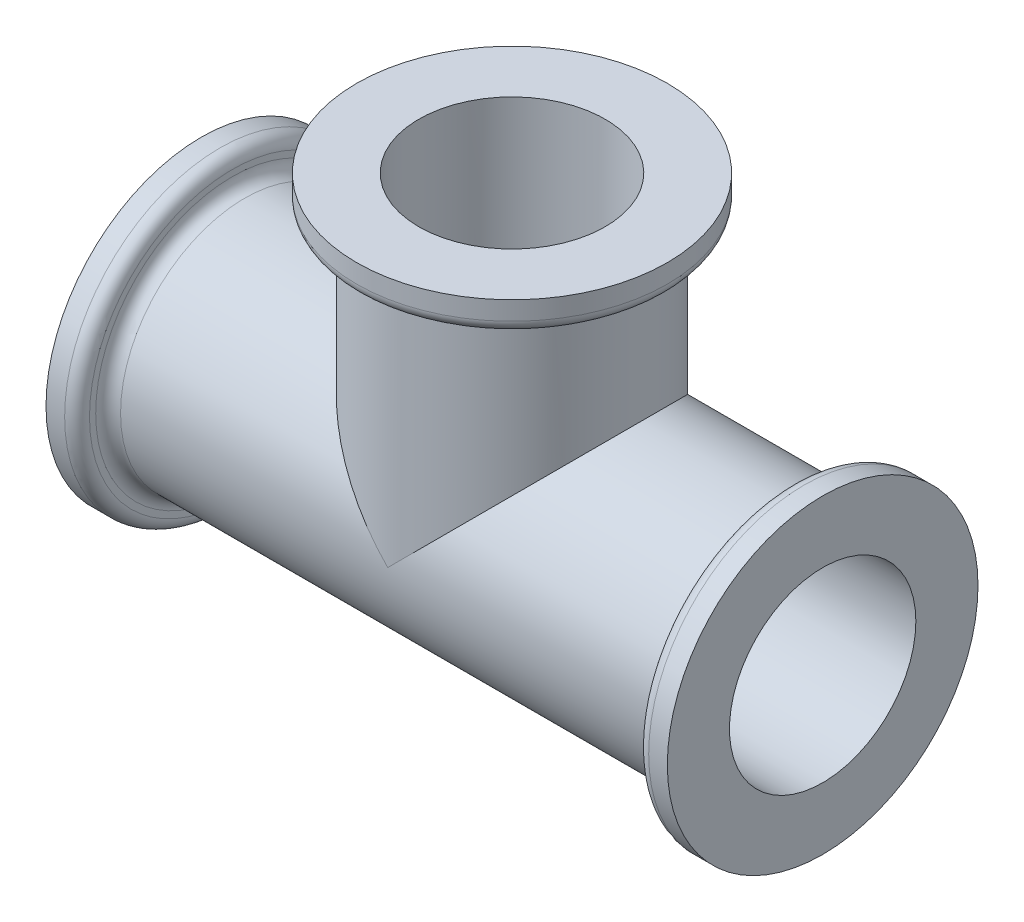
ISO-10303-21;
HEADER;
FILE_DESCRIPTION(('STEP AP214'),'2;1');
FILE_NAME('part.step','',(''),(''),'','','');
FILE_SCHEMA(('AUTOMOTIVE_DESIGN { 1 0 10303 214 1 1 1 1 }'));
ENDSEC;
DATA;
#1=APPLICATION_CONTEXT('core data for automotive mechanical design processes');
#2=APPLICATION_PROTOCOL_DEFINITION('international standard','automotive_design',2000,#1);
#3=PRODUCT_CONTEXT('',#1,'mechanical');
#4=PRODUCT('Part','Part','',(#3));
#5=PRODUCT_RELATED_PRODUCT_CATEGORY('part','',(#4));
#6=PRODUCT_DEFINITION_FORMATION('','',#4);
#7=PRODUCT_DEFINITION_CONTEXT('part definition',#1,'design');
#8=PRODUCT_DEFINITION('design','',#6,#7);
#9=PRODUCT_DEFINITION_SHAPE('','',#8);
#10=(LENGTH_UNIT() NAMED_UNIT(*) SI_UNIT(.MILLI.,.METRE.));
#11=(NAMED_UNIT(*) PLANE_ANGLE_UNIT() SI_UNIT($,.RADIAN.));
#12=(NAMED_UNIT(*) SI_UNIT($,.STERADIAN.) SOLID_ANGLE_UNIT());
#13=UNCERTAINTY_MEASURE_WITH_UNIT(LENGTH_MEASURE(1.E-05),#10,'distance_accuracy_value','');
#14=(GEOMETRIC_REPRESENTATION_CONTEXT(3) GLOBAL_UNCERTAINTY_ASSIGNED_CONTEXT((#13)) GLOBAL_UNIT_ASSIGNED_CONTEXT((#10,
#11,#12)) REPRESENTATION_CONTEXT('',''));
#15=CARTESIAN_POINT('',(0.,0.,0.));
#16=DIRECTION('',(0.,0.,1.));
#17=DIRECTION('',(1.,0.,0.));
#18=AXIS2_PLACEMENT_3D('',#15,#16,#17);
#19=CARTESIAN_POINT('',(0.,0.,0.));
#20=DIRECTION('',(0.,1.,0.));
#21=DIRECTION('',(0.,0.,1.));
#22=AXIS2_PLACEMENT_3D('',#19,#20,#21);
#23=CYLINDRICAL_SURFACE('',#22,10.);
#24=CARTESIAN_POINT('',(0.,19.,0.));
#25=DIRECTION('',(0.,1.,0.));
#26=DIRECTION('',(0.,0.,1.));
#27=AXIS2_PLACEMENT_3D('',#24,#25,#26);
#28=CIRCLE('',#27,10.);
#29=CARTESIAN_POINT('',(0.,19.,10.));
#30=VERTEX_POINT('',#29);
#31=EDGE_CURVE('E89',#30,#30,#28,.F.);
#32=ORIENTED_EDGE('',*,*,#31,.T.);
#33=EDGE_LOOP('',(#32));
#34=FACE_BOUND('',#33,.T.);
#35=CARTESIAN_POINT('',(0.,0.,0.));
#36=DIRECTION('',(-0.707106781186547,0.707106781186547,0.));
#37=DIRECTION('',(-0.707106781186547,-0.707106781186547,0.));
#38=AXIS2_PLACEMENT_3D('',#35,#36,#37);
#39=ELLIPSE('',#38,14.1421356237309,10.);
#40=CARTESIAN_POINT('',(0.,0.,-10.));
#41=VERTEX_POINT('',#40);
#42=CARTESIAN_POINT('',(0.,0.,10.));
#43=VERTEX_POINT('',#42);
#44=EDGE_CURVE('E56',#41,#43,#39,.F.);
#45=ORIENTED_EDGE('',*,*,#44,.F.);
#46=CARTESIAN_POINT('',(0.,0.,0.));
#47=DIRECTION('',(-0.707106781186547,-0.707106781186547,0.));
#48=DIRECTION('',(-0.707106781186547,0.707106781186547,0.));
#49=AXIS2_PLACEMENT_3D('',#46,#47,#48);
#50=ELLIPSE('',#49,14.1421356237309,10.);
#51=EDGE_CURVE('E71',#43,#41,#50,.T.);
#52=ORIENTED_EDGE('',*,*,#51,.F.);
#53=EDGE_LOOP('',(#45,#52));
#54=FACE_BOUND('',#53,.T.);
#55=ADVANCED_FACE('F35',(#34,#54),#23,.T.);
#56=CARTESIAN_POINT('',(25.,0.,0.));
#57=DIRECTION('',(-1.,0.,0.));
#58=DIRECTION('',(0.,0.,1.));
#59=AXIS2_PLACEMENT_3D('',#56,#57,#58);
#60=CYLINDRICAL_SURFACE('',#59,10.);
#61=CARTESIAN_POINT('',(-21.5,0.,0.));
#62=DIRECTION('',(-1.,0.,0.));
#63=DIRECTION('',(0.,0.,1.));
#64=AXIS2_PLACEMENT_3D('',#61,#62,#63);
#65=CIRCLE('',#64,10.);
#66=CARTESIAN_POINT('',(-21.5,0.,10.));
#67=VERTEX_POINT('',#66);
#68=EDGE_CURVE('E113',#67,#67,#65,.F.);
#69=ORIENTED_EDGE('',*,*,#68,.T.);
#70=EDGE_LOOP('',(#69));
#71=FACE_BOUND('',#70,.T.);
#72=CARTESIAN_POINT('',(21.5,0.,0.));
#73=DIRECTION('',(1.,0.,0.));
#74=DIRECTION('',(0.,0.,-1.));
#75=AXIS2_PLACEMENT_3D('',#72,#73,#74);
#76=CIRCLE('',#75,10.);
#77=CARTESIAN_POINT('',(21.5,0.,-10.));
#78=VERTEX_POINT('',#77);
#79=EDGE_CURVE('E110',#78,#78,#76,.F.);
#80=ORIENTED_EDGE('',*,*,#79,.T.);
#81=EDGE_LOOP('',(#80));
#82=FACE_BOUND('',#81,.T.);
#83=ORIENTED_EDGE('',*,*,#51,.T.);
#84=ORIENTED_EDGE('',*,*,#44,.T.);
#85=EDGE_LOOP('',(#83,#84));
#86=FACE_BOUND('',#85,.T.);
#87=ADVANCED_FACE('F133',(#71,#82,#86),#60,.T.);
#88=CARTESIAN_POINT('',(25.,0.,0.));
#89=DIRECTION('',(1.,0.,0.));
#90=DIRECTION('',(0.,0.,-1.));
#91=AXIS2_PLACEMENT_3D('',#88,#89,#90);
#92=PLANE('',#91);
#93=CARTESIAN_POINT('',(25.,0.,0.));
#94=DIRECTION('',(1.,0.,0.));
#95=DIRECTION('',(0.,0.,-1.));
#96=AXIS2_PLACEMENT_3D('',#93,#94,#95);
#97=CIRCLE('',#96,7.5);
#98=CARTESIAN_POINT('',(25.,0.,-7.5));
#99=VERTEX_POINT('',#98);
#100=EDGE_CURVE('E83',#99,#99,#97,.T.);
#101=ORIENTED_EDGE('',*,*,#100,.F.);
#102=EDGE_LOOP('',(#101));
#103=FACE_BOUND('',#102,.T.);
#104=CARTESIAN_POINT('',(25.,0.,0.));
#105=DIRECTION('',(1.,0.,0.));
#106=DIRECTION('',(0.,0.,-1.));
#107=AXIS2_PLACEMENT_3D('',#104,#105,#106);
#108=CIRCLE('',#107,12.5);
#109=CARTESIAN_POINT('',(25.,0.,-12.5));
#110=VERTEX_POINT('',#109);
#111=EDGE_CURVE('E80',#110,#110,#108,.T.);
#112=ORIENTED_EDGE('',*,*,#111,.T.);
#113=EDGE_LOOP('',(#112));
#114=FACE_BOUND('',#113,.T.);
#115=ADVANCED_FACE('F140',(#103,#114),#92,.T.);
#116=CARTESIAN_POINT('',(-25.,0.,0.));
#117=DIRECTION('',(1.,0.,0.));
#118=DIRECTION('',(0.,0.,-1.));
#119=AXIS2_PLACEMENT_3D('',#116,#117,#118);
#120=PLANE('',#119);
#121=CARTESIAN_POINT('',(-25.,0.,0.));
#122=DIRECTION('',(1.,0.,0.));
#123=DIRECTION('',(0.,0.,-1.));
#124=AXIS2_PLACEMENT_3D('',#121,#122,#123);
#125=CIRCLE('',#124,7.5);
#126=CARTESIAN_POINT('',(-25.,0.,-7.5));
#127=VERTEX_POINT('',#126);
#128=EDGE_CURVE('E86',#127,#127,#125,.T.);
#129=ORIENTED_EDGE('',*,*,#128,.T.);
#130=EDGE_LOOP('',(#129));
#131=FACE_BOUND('',#130,.T.);
#132=CARTESIAN_POINT('',(-25.,0.,0.));
#133=DIRECTION('',(1.,0.,0.));
#134=DIRECTION('',(0.,0.,-1.));
#135=AXIS2_PLACEMENT_3D('',#132,#133,#134);
#136=CIRCLE('',#135,12.5);
#137=CARTESIAN_POINT('',(-25.,0.,-12.5));
#138=VERTEX_POINT('',#137);
#139=EDGE_CURVE('E77',#138,#138,#136,.T.);
#140=ORIENTED_EDGE('',*,*,#139,.F.);
#141=EDGE_LOOP('',(#140));
#142=FACE_BOUND('',#141,.T.);
#143=ADVANCED_FACE('F143',(#131,#142),#120,.F.);
#144=CARTESIAN_POINT('',(22.5,0.,0.));
#145=DIRECTION('',(1.,0.,0.));
#146=DIRECTION('',(0.,0.,-1.));
#147=AXIS2_PLACEMENT_3D('',#144,#145,#146);
#148=PLANE('',#147);
#149=CARTESIAN_POINT('',(22.5,0.,0.));
#150=DIRECTION('',(1.,0.,0.));
#151=DIRECTION('',(0.,0.,-1.));
#152=AXIS2_PLACEMENT_3D('',#149,#150,#151);
#153=CIRCLE('',#152,11.5);
#154=CARTESIAN_POINT('',(22.5,0.,-11.5));
#155=VERTEX_POINT('',#154);
#156=EDGE_CURVE('E11',#155,#155,#153,.F.);
#157=ORIENTED_EDGE('',*,*,#156,.T.);
#158=EDGE_LOOP('',(#157));
#159=FACE_BOUND('',#158,.T.);
#160=CARTESIAN_POINT('',(22.5,0.,0.));
#161=DIRECTION('',(1.,0.,0.));
#162=DIRECTION('',(0.,0.,-1.));
#163=AXIS2_PLACEMENT_3D('',#160,#161,#162);
#164=CIRCLE('',#163,11.);
#165=CARTESIAN_POINT('',(22.5,0.,-11.));
#166=VERTEX_POINT('',#165);
#167=EDGE_CURVE('E43',#166,#166,#164,.T.);
#168=ORIENTED_EDGE('',*,*,#167,.T.);
#169=EDGE_LOOP('',(#168));
#170=FACE_BOUND('',#169,.T.);
#171=ADVANCED_FACE('F121',(#159,#170),#148,.F.);
#172=CARTESIAN_POINT('',(22.5,0.,0.));
#173=DIRECTION('',(1.,0.,0.));
#174=DIRECTION('',(0.,0.,-1.));
#175=AXIS2_PLACEMENT_3D('',#172,#173,#174);
#176=CYLINDRICAL_SURFACE('',#175,12.5);
#177=CARTESIAN_POINT('',(23.5,0.,0.));
#178=DIRECTION('',(1.,0.,0.));
#179=DIRECTION('',(0.,0.,-1.));
#180=AXIS2_PLACEMENT_3D('',#177,#178,#179);
#181=CIRCLE('',#180,12.5);
#182=CARTESIAN_POINT('',(23.5,0.,-12.5));
#183=VERTEX_POINT('',#182);
#184=EDGE_CURVE('E116',#183,#183,#181,.T.);
#185=ORIENTED_EDGE('',*,*,#184,.T.);
#186=EDGE_LOOP('',(#185));
#187=FACE_BOUND('',#186,.T.);
#188=ORIENTED_EDGE('',*,*,#111,.F.);
#189=EDGE_LOOP('',(#188));
#190=FACE_BOUND('',#189,.T.);
#191=ADVANCED_FACE('F151',(#187,#190),#176,.T.);
#192=CARTESIAN_POINT('',(-22.5,0.,0.));
#193=DIRECTION('',(-1.,0.,0.));
#194=DIRECTION('',(0.,0.,-1.));
#195=AXIS2_PLACEMENT_3D('',#192,#193,#194);
#196=PLANE('',#195);
#197=CARTESIAN_POINT('',(-22.5,0.,0.));
#198=DIRECTION('',(-1.,0.,0.));
#199=DIRECTION('',(0.,0.,1.));
#200=AXIS2_PLACEMENT_3D('',#197,#198,#199);
#201=CIRCLE('',#200,11.5);
#202=CARTESIAN_POINT('',(-22.5,0.,11.5));
#203=VERTEX_POINT('',#202);
#204=EDGE_CURVE('E104',#203,#203,#201,.F.);
#205=ORIENTED_EDGE('',*,*,#204,.T.);
#206=EDGE_LOOP('',(#205));
#207=FACE_BOUND('',#206,.T.);
#208=CARTESIAN_POINT('',(-22.5,0.,0.));
#209=DIRECTION('',(-1.,0.,0.));
#210=DIRECTION('',(0.,0.,1.));
#211=AXIS2_PLACEMENT_3D('',#208,#209,#210);
#212=CIRCLE('',#211,11.);
#213=CARTESIAN_POINT('',(-22.5,0.,11.));
#214=VERTEX_POINT('',#213);
#215=EDGE_CURVE('E101',#214,#214,#212,.T.);
#216=ORIENTED_EDGE('',*,*,#215,.T.);
#217=EDGE_LOOP('',(#216));
#218=FACE_BOUND('',#217,.T.);
#219=ADVANCED_FACE('F147',(#207,#218),#196,.F.);
#220=CARTESIAN_POINT('',(-22.5,0.,0.));
#221=DIRECTION('',(-1.,0.,0.));
#222=DIRECTION('',(0.,0.,-1.));
#223=AXIS2_PLACEMENT_3D('',#220,#221,#222);
#224=CYLINDRICAL_SURFACE('',#223,12.5);
#225=CARTESIAN_POINT('',(-23.5,0.,0.));
#226=DIRECTION('',(-1.,0.,0.));
#227=DIRECTION('',(0.,0.,1.));
#228=AXIS2_PLACEMENT_3D('',#225,#226,#227);
#229=CIRCLE('',#228,12.5);
#230=CARTESIAN_POINT('',(-23.5,0.,12.5));
#231=VERTEX_POINT('',#230);
#232=EDGE_CURVE('E107',#231,#231,#229,.T.);
#233=ORIENTED_EDGE('',*,*,#232,.T.);
#234=EDGE_LOOP('',(#233));
#235=FACE_BOUND('',#234,.T.);
#236=ORIENTED_EDGE('',*,*,#139,.T.);
#237=EDGE_LOOP('',(#236));
#238=FACE_BOUND('',#237,.T.);
#239=ADVANCED_FACE('F150',(#235,#238),#224,.T.);
#240=CARTESIAN_POINT('',(0.,0.,0.));
#241=DIRECTION('',(0.,1.,0.));
#242=DIRECTION('',(0.,0.,1.));
#243=AXIS2_PLACEMENT_3D('',#240,#241,#242);
#244=CYLINDRICAL_SURFACE('',#243,7.5);
#245=CARTESIAN_POINT('',(0.,22.5,0.));
#246=DIRECTION('',(0.,1.,0.));
#247=DIRECTION('',(0.,0.,1.));
#248=AXIS2_PLACEMENT_3D('',#245,#246,#247);
#249=CIRCLE('',#248,7.5);
#250=CARTESIAN_POINT('',(0.,22.5,7.5));
#251=VERTEX_POINT('',#250);
#252=EDGE_CURVE('E68',#251,#251,#249,.T.);
#253=ORIENTED_EDGE('',*,*,#252,.T.);
#254=EDGE_LOOP('',(#253));
#255=FACE_BOUND('',#254,.T.);
#256=CARTESIAN_POINT('',(0.,0.,0.));
#257=DIRECTION('',(0.707106781186547,0.707106781186547,0.));
#258=DIRECTION('',(-0.707106781186547,0.707106781186547,0.));
#259=AXIS2_PLACEMENT_3D('',#256,#257,#258);
#260=ELLIPSE('',#259,10.6066017177982,7.5);
#261=CARTESIAN_POINT('',(0.,0.,-7.5));
#262=VERTEX_POINT('',#261);
#263=CARTESIAN_POINT('',(0.,0.,7.5));
#264=VERTEX_POINT('',#263);
#265=EDGE_CURVE('E61',#262,#264,#260,.T.);
#266=ORIENTED_EDGE('',*,*,#265,.F.);
#267=CARTESIAN_POINT('',(0.,0.,0.));
#268=DIRECTION('',(-0.707106781186547,0.707106781186547,0.));
#269=DIRECTION('',(0.707106781186547,0.707106781186547,0.));
#270=AXIS2_PLACEMENT_3D('',#267,#268,#269);
#271=ELLIPSE('',#270,10.6066017177982,7.5);
#272=EDGE_CURVE('E49',#264,#262,#271,.T.);
#273=ORIENTED_EDGE('',*,*,#272,.F.);
#274=EDGE_LOOP('',(#266,#273));
#275=FACE_BOUND('',#274,.T.);
#276=ADVANCED_FACE('F62',(#255,#275),#244,.F.);
#277=CARTESIAN_POINT('',(0.,22.5,0.));
#278=DIRECTION('',(0.,1.,0.));
#279=DIRECTION('',(0.,0.,1.));
#280=AXIS2_PLACEMENT_3D('',#277,#278,#279);
#281=PLANE('',#280);
#282=ORIENTED_EDGE('',*,*,#252,.F.);
#283=EDGE_LOOP('',(#282));
#284=FACE_BOUND('',#283,.T.);
#285=CARTESIAN_POINT('',(0.,22.5,0.));
#286=DIRECTION('',(0.,1.,0.));
#287=DIRECTION('',(0.,0.,1.));
#288=AXIS2_PLACEMENT_3D('',#285,#286,#287);
#289=CIRCLE('',#288,12.5);
#290=CARTESIAN_POINT('',(0.,22.5,12.5));
#291=VERTEX_POINT('',#290);
#292=EDGE_CURVE('E64',#291,#291,#289,.T.);
#293=ORIENTED_EDGE('',*,*,#292,.T.);
#294=EDGE_LOOP('',(#293));
#295=FACE_BOUND('',#294,.T.);
#296=ADVANCED_FACE('F165',(#284,#295),#281,.T.);
#297=CARTESIAN_POINT('',(25.,0.,0.));
#298=DIRECTION('',(-1.,0.,0.));
#299=DIRECTION('',(0.,0.,1.));
#300=AXIS2_PLACEMENT_3D('',#297,#298,#299);
#301=CYLINDRICAL_SURFACE('',#300,7.5);
#302=ORIENTED_EDGE('',*,*,#272,.T.);
#303=ORIENTED_EDGE('',*,*,#265,.T.);
#304=EDGE_LOOP('',(#302,#303));
#305=FACE_BOUND('',#304,.T.);
#306=ORIENTED_EDGE('',*,*,#100,.T.);
#307=EDGE_LOOP('',(#306));
#308=FACE_BOUND('',#307,.T.);
#309=ORIENTED_EDGE('',*,*,#128,.F.);
#310=EDGE_LOOP('',(#309));
#311=FACE_BOUND('',#310,.T.);
#312=ADVANCED_FACE('F66',(#305,#308,#311),#301,.F.);
#313=CARTESIAN_POINT('',(0.,20.,0.));
#314=DIRECTION('',(0.,1.,0.));
#315=DIRECTION('',(0.,0.,1.));
#316=AXIS2_PLACEMENT_3D('',#313,#314,#315);
#317=CYLINDRICAL_SURFACE('',#316,12.5);
#318=CARTESIAN_POINT('',(0.,21.,0.));
#319=DIRECTION('',(0.,1.,0.));
#320=DIRECTION('',(0.,0.,1.));
#321=AXIS2_PLACEMENT_3D('',#318,#319,#320);
#322=CIRCLE('',#321,12.5);
#323=CARTESIAN_POINT('',(0.,21.,12.5));
#324=VERTEX_POINT('',#323);
#325=EDGE_CURVE('E98',#324,#324,#322,.T.);
#326=ORIENTED_EDGE('',*,*,#325,.T.);
#327=EDGE_LOOP('',(#326));
#328=FACE_BOUND('',#327,.T.);
#329=ORIENTED_EDGE('',*,*,#292,.F.);
#330=EDGE_LOOP('',(#329));
#331=FACE_BOUND('',#330,.T.);
#332=ADVANCED_FACE('F164',(#328,#331),#317,.T.);
#333=CARTESIAN_POINT('',(0.,20.,0.));
#334=DIRECTION('',(0.,1.,0.));
#335=DIRECTION('',(0.,0.,1.));
#336=AXIS2_PLACEMENT_3D('',#333,#334,#335);
#337=PLANE('',#336);
#338=CARTESIAN_POINT('',(0.,20.,0.));
#339=DIRECTION('',(0.,1.,0.));
#340=DIRECTION('',(0.,0.,1.));
#341=AXIS2_PLACEMENT_3D('',#338,#339,#340);
#342=CIRCLE('',#341,11.);
#343=CARTESIAN_POINT('',(0.,20.,11.));
#344=VERTEX_POINT('',#343);
#345=EDGE_CURVE('E95',#344,#344,#342,.T.);
#346=ORIENTED_EDGE('',*,*,#345,.T.);
#347=EDGE_LOOP('',(#346));
#348=FACE_BOUND('',#347,.T.);
#349=CARTESIAN_POINT('',(0.,20.,0.));
#350=DIRECTION('',(0.,1.,0.));
#351=DIRECTION('',(0.,0.,1.));
#352=AXIS2_PLACEMENT_3D('',#349,#350,#351);
#353=CIRCLE('',#352,11.5);
#354=CARTESIAN_POINT('',(0.,20.,11.5));
#355=VERTEX_POINT('',#354);
#356=EDGE_CURVE('E92',#355,#355,#353,.F.);
#357=ORIENTED_EDGE('',*,*,#356,.T.);
#358=EDGE_LOOP('',(#357));
#359=FACE_BOUND('',#358,.T.);
#360=ADVANCED_FACE('F176',(#348,#359),#337,.F.);
#361=CARTESIAN_POINT('',(0.,19.,0.));
#362=DIRECTION('',(0.,1.,0.));
#363=DIRECTION('',(0.,0.,1.));
#364=AXIS2_PLACEMENT_3D('',#361,#362,#363);
#365=TOROIDAL_SURFACE('',#364,11.,1.);
#366=ORIENTED_EDGE('',*,*,#345,.F.);
#367=EDGE_LOOP('',(#366));
#368=FACE_BOUND('',#367,.T.);
#369=ORIENTED_EDGE('',*,*,#31,.F.);
#370=EDGE_LOOP('',(#369));
#371=FACE_BOUND('',#370,.T.);
#372=ADVANCED_FACE('F172',(#368,#371),#365,.F.);
#373=CARTESIAN_POINT('',(0.,21.,0.));
#374=DIRECTION('',(0.,1.,0.));
#375=DIRECTION('',(0.,0.,1.));
#376=AXIS2_PLACEMENT_3D('',#373,#374,#375);
#377=TOROIDAL_SURFACE('',#376,11.5,1.);
#378=ORIENTED_EDGE('',*,*,#356,.F.);
#379=EDGE_LOOP('',(#378));
#380=FACE_BOUND('',#379,.T.);
#381=ORIENTED_EDGE('',*,*,#325,.F.);
#382=EDGE_LOOP('',(#381));
#383=FACE_BOUND('',#382,.T.);
#384=ADVANCED_FACE('F175',(#380,#383),#377,.T.);
#385=CARTESIAN_POINT('',(-23.5,0.,0.));
#386=DIRECTION('',(-1.,0.,0.));
#387=DIRECTION('',(0.,0.,1.));
#388=AXIS2_PLACEMENT_3D('',#385,#386,#387);
#389=TOROIDAL_SURFACE('',#388,11.5,1.);
#390=ORIENTED_EDGE('',*,*,#232,.F.);
#391=EDGE_LOOP('',(#390));
#392=FACE_BOUND('',#391,.T.);
#393=ORIENTED_EDGE('',*,*,#204,.F.);
#394=EDGE_LOOP('',(#393));
#395=FACE_BOUND('',#394,.T.);
#396=ADVANCED_FACE('F180',(#392,#395),#389,.T.);
#397=CARTESIAN_POINT('',(-21.5,0.,0.));
#398=DIRECTION('',(-1.,0.,0.));
#399=DIRECTION('',(0.,0.,1.));
#400=AXIS2_PLACEMENT_3D('',#397,#398,#399);
#401=TOROIDAL_SURFACE('',#400,11.,1.);
#402=ORIENTED_EDGE('',*,*,#68,.F.);
#403=EDGE_LOOP('',(#402));
#404=FACE_BOUND('',#403,.T.);
#405=ORIENTED_EDGE('',*,*,#215,.F.);
#406=EDGE_LOOP('',(#405));
#407=FACE_BOUND('',#406,.T.);
#408=ADVANCED_FACE('F129',(#404,#407),#401,.F.);
#409=CARTESIAN_POINT('',(23.5,0.,0.));
#410=DIRECTION('',(1.,0.,0.));
#411=DIRECTION('',(0.,0.,-1.));
#412=AXIS2_PLACEMENT_3D('',#409,#410,#411);
#413=TOROIDAL_SURFACE('',#412,11.5,1.);
#414=ORIENTED_EDGE('',*,*,#156,.F.);
#415=EDGE_LOOP('',(#414));
#416=FACE_BOUND('',#415,.T.);
#417=ORIENTED_EDGE('',*,*,#184,.F.);
#418=EDGE_LOOP('',(#417));
#419=FACE_BOUND('',#418,.T.);
#420=ADVANCED_FACE('F124',(#416,#419),#413,.T.);
#421=CARTESIAN_POINT('',(21.5,0.,0.));
#422=DIRECTION('',(1.,0.,0.));
#423=DIRECTION('',(0.,0.,-1.));
#424=AXIS2_PLACEMENT_3D('',#421,#422,#423);
#425=TOROIDAL_SURFACE('',#424,11.,1.);
#426=ORIENTED_EDGE('',*,*,#79,.F.);
#427=EDGE_LOOP('',(#426));
#428=FACE_BOUND('',#427,.T.);
#429=ORIENTED_EDGE('',*,*,#167,.F.);
#430=EDGE_LOOP('',(#429));
#431=FACE_BOUND('',#430,.T.);
#432=ADVANCED_FACE('F37',(#428,#431),#425,.F.);
#433=CLOSED_SHELL('',(#55,#87,#115,#143,#171,#191,#219,#239,#276,#296,#312,#332,#360,#372,#384,
#396,#408,#420,#432));
#434=MANIFOLD_SOLID_BREP('B2',#433);
#435=ADVANCED_BREP_SHAPE_REPRESENTATION('',(#18,#434),#14);
#436=SHAPE_DEFINITION_REPRESENTATION(#9,#435);
ENDSEC;
END-ISO-10303-21;
